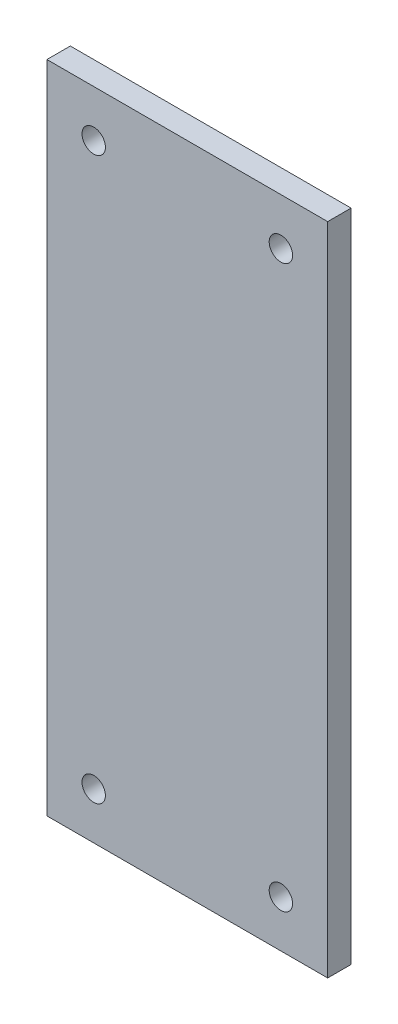
ISO-10303-21;
HEADER;
FILE_DESCRIPTION(('STEP AP214'),'2;1');
FILE_NAME('part.step','',(''),(''),'','','');
FILE_SCHEMA(('AUTOMOTIVE_DESIGN { 1 0 10303 214 1 1 1 1 }'));
ENDSEC;
DATA;
#1=APPLICATION_CONTEXT('core data for automotive mechanical design processes');
#2=APPLICATION_PROTOCOL_DEFINITION('international standard','automotive_design',2000,#1);
#3=PRODUCT_CONTEXT('',#1,'mechanical');
#4=PRODUCT('Part','Part','',(#3));
#5=PRODUCT_RELATED_PRODUCT_CATEGORY('part','',(#4));
#6=PRODUCT_DEFINITION_FORMATION('','',#4);
#7=PRODUCT_DEFINITION_CONTEXT('part definition',#1,'design');
#8=PRODUCT_DEFINITION('design','',#6,#7);
#9=PRODUCT_DEFINITION_SHAPE('','',#8);
#10=(LENGTH_UNIT() NAMED_UNIT(*) SI_UNIT(.MILLI.,.METRE.));
#11=(NAMED_UNIT(*) PLANE_ANGLE_UNIT() SI_UNIT($,.RADIAN.));
#12=(NAMED_UNIT(*) SI_UNIT($,.STERADIAN.) SOLID_ANGLE_UNIT());
#13=UNCERTAINTY_MEASURE_WITH_UNIT(LENGTH_MEASURE(1.E-05),#10,'distance_accuracy_value','');
#14=(GEOMETRIC_REPRESENTATION_CONTEXT(3) GLOBAL_UNCERTAINTY_ASSIGNED_CONTEXT((#13)) GLOBAL_UNIT_ASSIGNED_CONTEXT((#10,
#11,#12)) REPRESENTATION_CONTEXT('',''));
#15=CARTESIAN_POINT('',(0.,0.,0.));
#16=DIRECTION('',(0.,0.,1.));
#17=DIRECTION('',(1.,0.,0.));
#18=AXIS2_PLACEMENT_3D('',#15,#16,#17);
#19=CARTESIAN_POINT('',(0.,0.,6.35));
#20=DIRECTION('',(0.,0.,1.));
#21=DIRECTION('',(1.,0.,0.));
#22=AXIS2_PLACEMENT_3D('',#19,#20,#21);
#23=PLANE('',#22);
#24=CARTESIAN_POINT('',(-85.6630890900666,31.75,6.35));
#25=DIRECTION('',(0.,0.,1.));
#26=DIRECTION('',(1.,0.,0.));
#27=AXIS2_PLACEMENT_3D('',#24,#25,#26);
#28=CIRCLE('',#27,3.17500000000003);
#29=CARTESIAN_POINT('',(-82.4880890900665,31.75,6.35));
#30=VERTEX_POINT('',#29);
#31=EDGE_CURVE('E129',#30,#30,#28,.T.);
#32=ORIENTED_EDGE('',*,*,#31,.F.);
#33=EDGE_LOOP('',(#32));
#34=FACE_BOUND('',#33,.T.);
#35=CARTESIAN_POINT('',(-85.6630890900666,-120.65,6.35));
#36=DIRECTION('',(0.,0.,1.));
#37=DIRECTION('',(1.,0.,0.));
#38=AXIS2_PLACEMENT_3D('',#35,#36,#37);
#39=CIRCLE('',#38,3.17500000000003);
#40=CARTESIAN_POINT('',(-82.4880890900665,-120.65,6.35));
#41=VERTEX_POINT('',#40);
#42=EDGE_CURVE('E108',#41,#41,#39,.T.);
#43=ORIENTED_EDGE('',*,*,#42,.F.);
#44=EDGE_LOOP('',(#43));
#45=FACE_BOUND('',#44,.T.);
#46=DIRECTION('',(0.,-1.,0.));
#47=VECTOR('',#46,1.);
#48=CARTESIAN_POINT('',(-149.163089090067,44.4500000000001,6.35));
#49=LINE('',#48,#47);
#50=CARTESIAN_POINT('',(-149.163089090067,44.4500000000001,6.35));
#51=VERTEX_POINT('',#50);
#52=CARTESIAN_POINT('',(-149.163089090067,-133.35,6.35));
#53=VERTEX_POINT('',#52);
#54=EDGE_CURVE('E93',#51,#53,#49,.T.);
#55=ORIENTED_EDGE('',*,*,#54,.T.);
#56=DIRECTION('',(1.,0.,0.));
#57=VECTOR('',#56,1.);
#58=CARTESIAN_POINT('',(-149.163089090067,-133.35,6.35));
#59=LINE('',#58,#57);
#60=CARTESIAN_POINT('',(-72.9630890900666,-133.35,6.35));
#61=VERTEX_POINT('',#60);
#62=EDGE_CURVE('E88',#53,#61,#59,.T.);
#63=ORIENTED_EDGE('',*,*,#62,.T.);
#64=DIRECTION('',(0.,1.,0.));
#65=VECTOR('',#64,1.);
#66=CARTESIAN_POINT('',(-72.9630890900666,44.4500000000001,6.35));
#67=LINE('',#66,#65);
#68=CARTESIAN_POINT('',(-72.9630890900666,44.4500000000001,6.35));
#69=VERTEX_POINT('',#68);
#70=EDGE_CURVE('E91',#61,#69,#67,.T.);
#71=ORIENTED_EDGE('',*,*,#70,.T.);
#72=DIRECTION('',(-1.,0.,0.));
#73=VECTOR('',#72,1.);
#74=CARTESIAN_POINT('',(-149.163089090067,44.4500000000001,6.35));
#75=LINE('',#74,#73);
#76=EDGE_CURVE('E58',#69,#51,#75,.T.);
#77=ORIENTED_EDGE('',*,*,#76,.T.);
#78=EDGE_LOOP('',(#55,#63,#71,#77));
#79=FACE_BOUND('',#78,.T.);
#80=CARTESIAN_POINT('',(-136.463089090067,-120.65,6.35));
#81=DIRECTION('',(0.,0.,1.));
#82=DIRECTION('',(1.,0.,0.));
#83=AXIS2_PLACEMENT_3D('',#80,#81,#82);
#84=CIRCLE('',#83,3.17500000000003);
#85=CARTESIAN_POINT('',(-133.288089090067,-120.65,6.35));
#86=VERTEX_POINT('',#85);
#87=EDGE_CURVE('E123',#86,#86,#84,.T.);
#88=ORIENTED_EDGE('',*,*,#87,.F.);
#89=EDGE_LOOP('',(#88));
#90=FACE_BOUND('',#89,.T.);
#91=CARTESIAN_POINT('',(-136.463089090067,31.75,6.35));
#92=DIRECTION('',(0.,0.,1.));
#93=DIRECTION('',(1.,0.,0.));
#94=AXIS2_PLACEMENT_3D('',#91,#92,#93);
#95=CIRCLE('',#94,3.175);
#96=CARTESIAN_POINT('',(-133.288089090067,31.75,6.35));
#97=VERTEX_POINT('',#96);
#98=EDGE_CURVE('E135',#97,#97,#95,.T.);
#99=ORIENTED_EDGE('',*,*,#98,.F.);
#100=EDGE_LOOP('',(#99));
#101=FACE_BOUND('',#100,.T.);
#102=ADVANCED_FACE('F41',(#34,#45,#79,#90,#101),#23,.T.);
#103=CARTESIAN_POINT('',(0.,0.,0.));
#104=DIRECTION('',(0.,0.,1.));
#105=DIRECTION('',(1.,0.,0.));
#106=AXIS2_PLACEMENT_3D('',#103,#104,#105);
#107=PLANE('',#106);
#108=DIRECTION('',(0.,-1.,0.));
#109=VECTOR('',#108,1.);
#110=CARTESIAN_POINT('',(-149.163089090067,44.4500000000001,0.));
#111=LINE('',#110,#109);
#112=CARTESIAN_POINT('',(-149.163089090067,44.4500000000001,0.));
#113=VERTEX_POINT('',#112);
#114=CARTESIAN_POINT('',(-149.163089090067,-133.35,0.));
#115=VERTEX_POINT('',#114);
#116=EDGE_CURVE('E105',#113,#115,#111,.T.);
#117=ORIENTED_EDGE('',*,*,#116,.F.);
#118=DIRECTION('',(-1.,0.,0.));
#119=VECTOR('',#118,1.);
#120=CARTESIAN_POINT('',(-149.163089090067,44.4500000000001,0.));
#121=LINE('',#120,#119);
#122=CARTESIAN_POINT('',(-72.9630890900666,44.4500000000001,0.));
#123=VERTEX_POINT('',#122);
#124=EDGE_CURVE('E81',#123,#113,#121,.T.);
#125=ORIENTED_EDGE('',*,*,#124,.F.);
#126=DIRECTION('',(0.,1.,0.));
#127=VECTOR('',#126,1.);
#128=CARTESIAN_POINT('',(-72.9630890900666,44.4500000000001,0.));
#129=LINE('',#128,#127);
#130=CARTESIAN_POINT('',(-72.9630890900666,-133.35,0.));
#131=VERTEX_POINT('',#130);
#132=EDGE_CURVE('E75',#131,#123,#129,.T.);
#133=ORIENTED_EDGE('',*,*,#132,.F.);
#134=DIRECTION('',(1.,0.,0.));
#135=VECTOR('',#134,1.);
#136=CARTESIAN_POINT('',(-149.163089090067,-133.35,0.));
#137=LINE('',#136,#135);
#138=EDGE_CURVE('E97',#115,#131,#137,.T.);
#139=ORIENTED_EDGE('',*,*,#138,.F.);
#140=EDGE_LOOP('',(#117,#125,#133,#139));
#141=FACE_BOUND('',#140,.T.);
#142=CARTESIAN_POINT('',(-85.6630890900666,-120.65,0.));
#143=DIRECTION('',(0.,0.,1.));
#144=DIRECTION('',(1.,0.,0.));
#145=AXIS2_PLACEMENT_3D('',#142,#143,#144);
#146=CIRCLE('',#145,3.17500000000003);
#147=CARTESIAN_POINT('',(-82.4880890900665,-120.65,0.));
#148=VERTEX_POINT('',#147);
#149=EDGE_CURVE('E120',#148,#148,#146,.T.);
#150=ORIENTED_EDGE('',*,*,#149,.T.);
#151=EDGE_LOOP('',(#150));
#152=FACE_BOUND('',#151,.T.);
#153=CARTESIAN_POINT('',(-136.463089090067,-120.65,0.));
#154=DIRECTION('',(0.,0.,1.));
#155=DIRECTION('',(1.,0.,0.));
#156=AXIS2_PLACEMENT_3D('',#153,#154,#155);
#157=CIRCLE('',#156,3.17500000000003);
#158=CARTESIAN_POINT('',(-133.288089090067,-120.65,0.));
#159=VERTEX_POINT('',#158);
#160=EDGE_CURVE('E126',#159,#159,#157,.T.);
#161=ORIENTED_EDGE('',*,*,#160,.T.);
#162=EDGE_LOOP('',(#161));
#163=FACE_BOUND('',#162,.T.);
#164=CARTESIAN_POINT('',(-85.6630890900666,31.75,0.));
#165=DIRECTION('',(0.,0.,1.));
#166=DIRECTION('',(1.,0.,0.));
#167=AXIS2_PLACEMENT_3D('',#164,#165,#166);
#168=CIRCLE('',#167,3.17500000000003);
#169=CARTESIAN_POINT('',(-82.4880890900665,31.75,0.));
#170=VERTEX_POINT('',#169);
#171=EDGE_CURVE('E132',#170,#170,#168,.T.);
#172=ORIENTED_EDGE('',*,*,#171,.T.);
#173=EDGE_LOOP('',(#172));
#174=FACE_BOUND('',#173,.T.);
#175=CARTESIAN_POINT('',(-136.463089090067,31.75,0.));
#176=DIRECTION('',(0.,0.,1.));
#177=DIRECTION('',(1.,0.,0.));
#178=AXIS2_PLACEMENT_3D('',#175,#176,#177);
#179=CIRCLE('',#178,3.175);
#180=CARTESIAN_POINT('',(-133.288089090067,31.75,0.));
#181=VERTEX_POINT('',#180);
#182=EDGE_CURVE('E138',#181,#181,#179,.T.);
#183=ORIENTED_EDGE('',*,*,#182,.T.);
#184=EDGE_LOOP('',(#183));
#185=FACE_BOUND('',#184,.T.);
#186=ADVANCED_FACE('F116',(#141,#152,#163,#174,#185),#107,.F.);
#187=CARTESIAN_POINT('',(-149.163089090067,44.4500000000001,6.35));
#188=DIRECTION('',(1.,0.,0.));
#189=DIRECTION('',(0.,0.,-1.));
#190=AXIS2_PLACEMENT_3D('',#187,#188,#189);
#191=PLANE('',#190);
#192=ORIENTED_EDGE('',*,*,#116,.T.);
#193=DIRECTION('',(0.,0.,-1.));
#194=VECTOR('',#193,1.);
#195=CARTESIAN_POINT('',(-149.163089090067,-133.35,6.35));
#196=LINE('',#195,#194);
#197=EDGE_CURVE('E11',#53,#115,#196,.T.);
#198=ORIENTED_EDGE('',*,*,#197,.F.);
#199=ORIENTED_EDGE('',*,*,#54,.F.);
#200=DIRECTION('',(0.,0.,-1.));
#201=VECTOR('',#200,1.);
#202=CARTESIAN_POINT('',(-149.163089090067,44.4500000000001,6.35));
#203=LINE('',#202,#201);
#204=EDGE_CURVE('E101',#51,#113,#203,.T.);
#205=ORIENTED_EDGE('',*,*,#204,.T.);
#206=EDGE_LOOP('',(#192,#198,#199,#205));
#207=FACE_BOUND('',#206,.T.);
#208=ADVANCED_FACE('F43',(#207),#191,.F.);
#209=CARTESIAN_POINT('',(-149.163089090067,-133.35,6.35));
#210=DIRECTION('',(0.,1.,0.));
#211=DIRECTION('',(0.,0.,1.));
#212=AXIS2_PLACEMENT_3D('',#209,#210,#211);
#213=PLANE('',#212);
#214=ORIENTED_EDGE('',*,*,#138,.T.);
#215=DIRECTION('',(0.,0.,-1.));
#216=VECTOR('',#215,1.);
#217=CARTESIAN_POINT('',(-72.9630890900666,-133.35,6.35));
#218=LINE('',#217,#216);
#219=EDGE_CURVE('E50',#61,#131,#218,.T.);
#220=ORIENTED_EDGE('',*,*,#219,.F.);
#221=ORIENTED_EDGE('',*,*,#62,.F.);
#222=ORIENTED_EDGE('',*,*,#197,.T.);
#223=EDGE_LOOP('',(#214,#220,#221,#222));
#224=FACE_BOUND('',#223,.T.);
#225=ADVANCED_FACE('F96',(#224),#213,.F.);
#226=CARTESIAN_POINT('',(-72.9630890900666,44.4500000000001,6.35));
#227=DIRECTION('',(-1.,0.,0.));
#228=DIRECTION('',(0.,0.,1.));
#229=AXIS2_PLACEMENT_3D('',#226,#227,#228);
#230=PLANE('',#229);
#231=ORIENTED_EDGE('',*,*,#132,.T.);
#232=DIRECTION('',(0.,0.,-1.));
#233=VECTOR('',#232,1.);
#234=CARTESIAN_POINT('',(-72.9630890900666,44.4500000000001,6.35));
#235=LINE('',#234,#233);
#236=EDGE_CURVE('E98',#69,#123,#235,.T.);
#237=ORIENTED_EDGE('',*,*,#236,.F.);
#238=ORIENTED_EDGE('',*,*,#70,.F.);
#239=ORIENTED_EDGE('',*,*,#219,.T.);
#240=EDGE_LOOP('',(#231,#237,#238,#239));
#241=FACE_BOUND('',#240,.T.);
#242=ADVANCED_FACE('F99',(#241),#230,.F.);
#243=CARTESIAN_POINT('',(-149.163089090067,44.4500000000001,6.35));
#244=DIRECTION('',(0.,-1.,0.));
#245=DIRECTION('',(0.,0.,-1.));
#246=AXIS2_PLACEMENT_3D('',#243,#244,#245);
#247=PLANE('',#246);
#248=ORIENTED_EDGE('',*,*,#124,.T.);
#249=ORIENTED_EDGE('',*,*,#204,.F.);
#250=ORIENTED_EDGE('',*,*,#76,.F.);
#251=ORIENTED_EDGE('',*,*,#236,.T.);
#252=EDGE_LOOP('',(#248,#249,#250,#251));
#253=FACE_BOUND('',#252,.T.);
#254=ADVANCED_FACE('F113',(#253),#247,.F.);
#255=CARTESIAN_POINT('',(-85.6630890900666,-120.65,6.35));
#256=DIRECTION('',(0.,0.,-1.));
#257=DIRECTION('',(-1.,0.,0.));
#258=AXIS2_PLACEMENT_3D('',#255,#256,#257);
#259=CYLINDRICAL_SURFACE('',#258,3.17500000000003);
#260=ORIENTED_EDGE('',*,*,#42,.T.);
#261=EDGE_LOOP('',(#260));
#262=FACE_BOUND('',#261,.T.);
#263=ORIENTED_EDGE('',*,*,#149,.F.);
#264=EDGE_LOOP('',(#263));
#265=FACE_BOUND('',#264,.T.);
#266=ADVANCED_FACE('F157',(#262,#265),#259,.F.);
#267=CARTESIAN_POINT('',(-136.463089090067,-120.65,6.35));
#268=DIRECTION('',(0.,0.,-1.));
#269=DIRECTION('',(-1.,0.,0.));
#270=AXIS2_PLACEMENT_3D('',#267,#268,#269);
#271=CYLINDRICAL_SURFACE('',#270,3.17500000000003);
#272=ORIENTED_EDGE('',*,*,#87,.T.);
#273=EDGE_LOOP('',(#272));
#274=FACE_BOUND('',#273,.T.);
#275=ORIENTED_EDGE('',*,*,#160,.F.);
#276=EDGE_LOOP('',(#275));
#277=FACE_BOUND('',#276,.T.);
#278=ADVANCED_FACE('F202',(#274,#277),#271,.F.);
#279=CARTESIAN_POINT('',(-85.6630890900666,31.75,6.35));
#280=DIRECTION('',(0.,0.,-1.));
#281=DIRECTION('',(-1.,0.,0.));
#282=AXIS2_PLACEMENT_3D('',#279,#280,#281);
#283=CYLINDRICAL_SURFACE('',#282,3.17500000000003);
#284=ORIENTED_EDGE('',*,*,#31,.T.);
#285=EDGE_LOOP('',(#284));
#286=FACE_BOUND('',#285,.T.);
#287=ORIENTED_EDGE('',*,*,#171,.F.);
#288=EDGE_LOOP('',(#287));
#289=FACE_BOUND('',#288,.T.);
#290=ADVANCED_FACE('F210',(#286,#289),#283,.F.);
#291=CARTESIAN_POINT('',(-136.463089090067,31.75,6.35));
#292=DIRECTION('',(0.,0.,-1.));
#293=DIRECTION('',(-1.,0.,0.));
#294=AXIS2_PLACEMENT_3D('',#291,#292,#293);
#295=CYLINDRICAL_SURFACE('',#294,3.175);
#296=ORIENTED_EDGE('',*,*,#98,.T.);
#297=EDGE_LOOP('',(#296));
#298=FACE_BOUND('',#297,.T.);
#299=ORIENTED_EDGE('',*,*,#182,.F.);
#300=EDGE_LOOP('',(#299));
#301=FACE_BOUND('',#300,.T.);
#302=ADVANCED_FACE('F144',(#298,#301),#295,.F.);
#303=CLOSED_SHELL('',(#102,#186,#208,#225,#242,#254,#266,#278,#290,#302));
#304=MANIFOLD_SOLID_BREP('B2',#303);
#305=ADVANCED_BREP_SHAPE_REPRESENTATION('',(#18,#304),#14);
#306=SHAPE_DEFINITION_REPRESENTATION(#9,#305);
ENDSEC;
END-ISO-10303-21;
